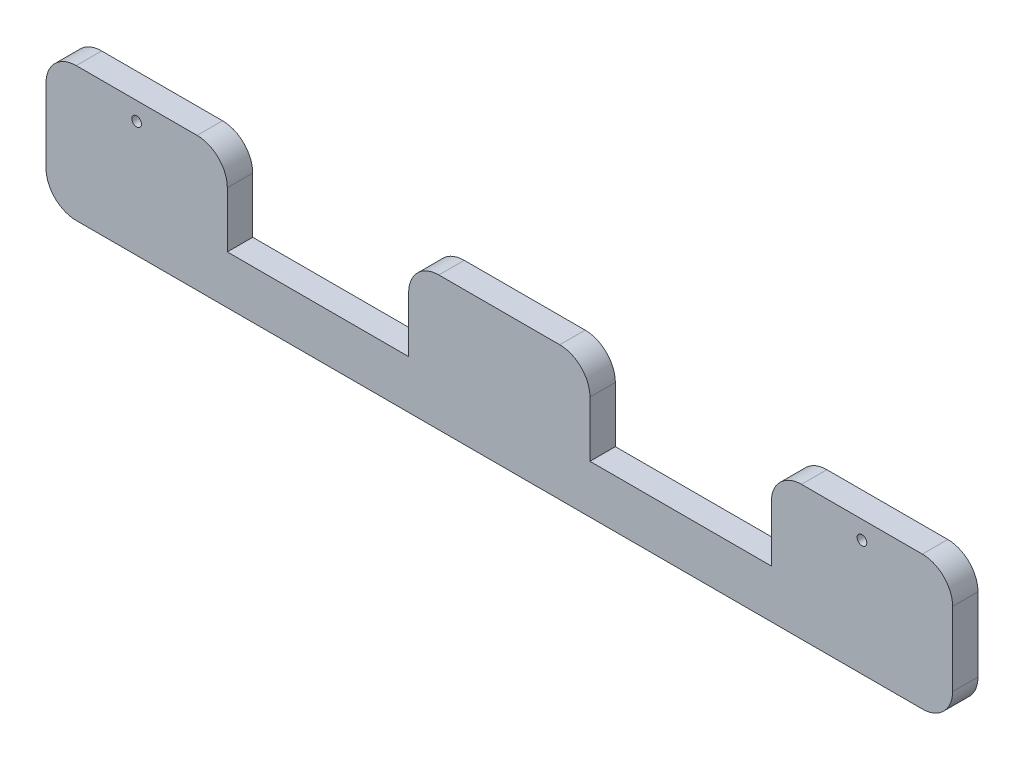
ISO-10303-21;
HEADER;
FILE_DESCRIPTION(('STEP AP214'),'2;1');
FILE_NAME('part.step','',(''),(''),'','','');
FILE_SCHEMA(('AUTOMOTIVE_DESIGN { 1 0 10303 214 1 1 1 1 }'));
ENDSEC;
DATA;
#1=APPLICATION_CONTEXT('core data for automotive mechanical design processes');
#2=APPLICATION_PROTOCOL_DEFINITION('international standard','automotive_design',2000,#1);
#3=PRODUCT_CONTEXT('',#1,'mechanical');
#4=PRODUCT('Part','Part','',(#3));
#5=PRODUCT_RELATED_PRODUCT_CATEGORY('part','',(#4));
#6=PRODUCT_DEFINITION_FORMATION('','',#4);
#7=PRODUCT_DEFINITION_CONTEXT('part definition',#1,'design');
#8=PRODUCT_DEFINITION('design','',#6,#7);
#9=PRODUCT_DEFINITION_SHAPE('','',#8);
#10=(LENGTH_UNIT() NAMED_UNIT(*) SI_UNIT(.MILLI.,.METRE.));
#11=(NAMED_UNIT(*) PLANE_ANGLE_UNIT() SI_UNIT($,.RADIAN.));
#12=(NAMED_UNIT(*) SI_UNIT($,.STERADIAN.) SOLID_ANGLE_UNIT());
#13=UNCERTAINTY_MEASURE_WITH_UNIT(LENGTH_MEASURE(1.E-05),#10,'distance_accuracy_value','');
#14=(GEOMETRIC_REPRESENTATION_CONTEXT(3) GLOBAL_UNCERTAINTY_ASSIGNED_CONTEXT((#13)) GLOBAL_UNIT_ASSIGNED_CONTEXT((#10,
#11,#12)) REPRESENTATION_CONTEXT('',''));
#15=CARTESIAN_POINT('',(0.,0.,0.));
#16=DIRECTION('',(0.,0.,1.));
#17=DIRECTION('',(1.,0.,0.));
#18=AXIS2_PLACEMENT_3D('',#15,#16,#17);
#19=CARTESIAN_POINT('',(-85.0624454176962,-31.2608196621493,5.334));
#20=DIRECTION('',(0.,-1.,0.));
#21=DIRECTION('',(0.,0.,-1.));
#22=AXIS2_PLACEMENT_3D('',#19,#20,#21);
#23=PLANE('',#22);
#24=DIRECTION('',(-1.,0.,0.));
#25=VECTOR('',#24,1.);
#26=CARTESIAN_POINT('',(-85.0624454176962,-31.2608196621493,5.334));
#27=LINE('',#26,#25);
#28=CARTESIAN_POINT('',(22.8875545823038,-31.2608196621493,5.334));
#29=VERTEX_POINT('',#28);
#30=CARTESIAN_POINT('',(-2.5124454176962,-31.2608196621493,5.334));
#31=VERTEX_POINT('',#30);
#32=EDGE_CURVE('E247',#29,#31,#27,.T.);
#33=ORIENTED_EDGE('',*,*,#32,.F.);
#34=DIRECTION('',(0.,0.,1.));
#35=VECTOR('',#34,1.);
#36=CARTESIAN_POINT('',(22.8875545823038,-31.2608196621493,5.334));
#37=LINE('',#36,#35);
#38=CARTESIAN_POINT('',(22.8875545823038,-31.2608196621493,0.));
#39=VERTEX_POINT('',#38);
#40=EDGE_CURVE('E280',#29,#39,#37,.F.);
#41=ORIENTED_EDGE('',*,*,#40,.T.);
#42=DIRECTION('',(-1.,0.,0.));
#43=VECTOR('',#42,1.);
#44=CARTESIAN_POINT('',(-85.0624454176962,-31.2608196621493,0.));
#45=LINE('',#44,#43);
#46=CARTESIAN_POINT('',(-2.5124454176962,-31.2608196621493,0.));
#47=VERTEX_POINT('',#46);
#48=EDGE_CURVE('E259',#39,#47,#45,.T.);
#49=ORIENTED_EDGE('',*,*,#48,.T.);
#50=DIRECTION('',(0.,0.,1.));
#51=VECTOR('',#50,1.);
#52=CARTESIAN_POINT('',(-2.5124454176962,-31.2608196621493,5.334));
#53=LINE('',#52,#51);
#54=EDGE_CURVE('E277',#47,#31,#53,.T.);
#55=ORIENTED_EDGE('',*,*,#54,.T.);
#56=EDGE_LOOP('',(#33,#41,#49,#55));
#57=FACE_BOUND('',#56,.T.);
#58=ADVANCED_FACE('F37',(#57),#23,.F.);
#59=CARTESIAN_POINT('',(-53.3124454176962,-31.2608196621493,5.334));
#60=VERTEX_POINT('',#59);
#61=CARTESIAN_POINT('',(-78.7124454176962,-31.2608196621493,5.334));
#62=VERTEX_POINT('',#61);
#63=EDGE_CURVE('E242',#60,#62,#27,.T.);
#64=ORIENTED_EDGE('',*,*,#63,.F.);
#65=DIRECTION('',(0.,0.,1.));
#66=VECTOR('',#65,1.);
#67=CARTESIAN_POINT('',(-53.3124454176962,-31.2608196621493,5.334));
#68=LINE('',#67,#66);
#69=CARTESIAN_POINT('',(-53.3124454176962,-31.2608196621493,0.));
#70=VERTEX_POINT('',#69);
#71=EDGE_CURVE('E302',#60,#70,#68,.F.);
#72=ORIENTED_EDGE('',*,*,#71,.T.);
#73=CARTESIAN_POINT('',(-78.7124454176962,-31.2608196621493,0.));
#74=VERTEX_POINT('',#73);
#75=EDGE_CURVE('E256',#70,#74,#45,.T.);
#76=ORIENTED_EDGE('',*,*,#75,.T.);
#77=DIRECTION('',(0.,0.,-1.));
#78=VECTOR('',#77,1.);
#79=CARTESIAN_POINT('',(-78.7124454176962,-31.2608196621493,5.334));
#80=LINE('',#79,#78);
#81=EDGE_CURVE('E300',#74,#62,#80,.F.);
#82=ORIENTED_EDGE('',*,*,#81,.T.);
#83=EDGE_LOOP('',(#64,#72,#76,#82));
#84=FACE_BOUND('',#83,.T.);
#85=ADVANCED_FACE('F379',(#84),#23,.F.);
#86=CARTESIAN_POINT('',(-85.0624454176962,-31.2608196621493,5.334));
#87=DIRECTION('',(1.,0.,0.));
#88=DIRECTION('',(0.,1.,0.));
#89=AXIS2_PLACEMENT_3D('',#86,#87,#88);
#90=PLANE('',#89);
#91=DIRECTION('',(0.,-1.,0.));
#92=VECTOR('',#91,1.);
#93=CARTESIAN_POINT('',(-85.0624454176962,-31.2608196621493,0.));
#94=LINE('',#93,#92);
#95=CARTESIAN_POINT('',(-85.0624454176962,-37.6108196621493,0.));
#96=VERTEX_POINT('',#95);
#97=CARTESIAN_POINT('',(-85.0624454176962,-53.1048196621493,0.));
#98=VERTEX_POINT('',#97);
#99=EDGE_CURVE('E229',#96,#98,#94,.T.);
#100=ORIENTED_EDGE('',*,*,#99,.T.);
#101=DIRECTION('',(0.,0.,-1.));
#102=VECTOR('',#101,1.);
#103=CARTESIAN_POINT('',(-85.0624454176962,-53.1048196621493,5.334));
#104=LINE('',#103,#102);
#105=CARTESIAN_POINT('',(-85.0624454176962,-53.1048196621493,5.334));
#106=VERTEX_POINT('',#105);
#107=EDGE_CURVE('E11',#98,#106,#104,.F.);
#108=ORIENTED_EDGE('',*,*,#107,.T.);
#109=DIRECTION('',(0.,-1.,0.));
#110=VECTOR('',#109,1.);
#111=CARTESIAN_POINT('',(-85.0624454176962,-31.2608196621493,5.334));
#112=LINE('',#111,#110);
#113=CARTESIAN_POINT('',(-85.0624454176962,-37.6108196621493,5.334));
#114=VERTEX_POINT('',#113);
#115=EDGE_CURVE('E232',#114,#106,#112,.T.);
#116=ORIENTED_EDGE('',*,*,#115,.F.);
#117=DIRECTION('',(0.,0.,-1.));
#118=VECTOR('',#117,1.);
#119=CARTESIAN_POINT('',(-85.0624454176962,-37.6108196621493,5.334));
#120=LINE('',#119,#118);
#121=EDGE_CURVE('E45',#114,#96,#120,.T.);
#122=ORIENTED_EDGE('',*,*,#121,.T.);
#123=EDGE_LOOP('',(#100,#108,#116,#122));
#124=FACE_BOUND('',#123,.T.);
#125=ADVANCED_FACE('F326',(#124),#90,.F.);
#126=CARTESIAN_POINT('',(-85.0624454176962,-59.4548196621493,5.334));
#127=DIRECTION('',(0.,1.,0.));
#128=DIRECTION('',(0.,0.,1.));
#129=AXIS2_PLACEMENT_3D('',#126,#127,#128);
#130=PLANE('',#129);
#131=DIRECTION('',(1.,0.,0.));
#132=VECTOR('',#131,1.);
#133=CARTESIAN_POINT('',(-85.0624454176962,-59.4548196621493,0.));
#134=LINE('',#133,#132);
#135=CARTESIAN_POINT('',(-78.7124454176962,-59.4548196621493,0.));
#136=VERTEX_POINT('',#135);
#137=CARTESIAN_POINT('',(99.0875545823038,-59.4548196621493,0.));
#138=VERTEX_POINT('',#137);
#139=EDGE_CURVE('E250',#136,#138,#134,.T.);
#140=ORIENTED_EDGE('',*,*,#139,.T.);
#141=DIRECTION('',(0.,0.,-1.));
#142=VECTOR('',#141,1.);
#143=CARTESIAN_POINT('',(99.0875545823038,-59.4548196621493,5.334));
#144=LINE('',#143,#142);
#145=CARTESIAN_POINT('',(99.0875545823038,-59.4548196621493,5.334));
#146=VERTEX_POINT('',#145);
#147=EDGE_CURVE('E320',#138,#146,#144,.F.);
#148=ORIENTED_EDGE('',*,*,#147,.T.);
#149=DIRECTION('',(1.,0.,0.));
#150=VECTOR('',#149,1.);
#151=CARTESIAN_POINT('',(-85.0624454176962,-59.4548196621493,5.334));
#152=LINE('',#151,#150);
#153=CARTESIAN_POINT('',(-78.7124454176962,-59.4548196621493,5.334));
#154=VERTEX_POINT('',#153);
#155=EDGE_CURVE('E235',#154,#146,#152,.T.);
#156=ORIENTED_EDGE('',*,*,#155,.F.);
#157=DIRECTION('',(0.,0.,-1.));
#158=VECTOR('',#157,1.);
#159=CARTESIAN_POINT('',(-78.7124454176962,-59.4548196621493,5.334));
#160=LINE('',#159,#158);
#161=EDGE_CURVE('E317',#154,#136,#160,.T.);
#162=ORIENTED_EDGE('',*,*,#161,.T.);
#163=EDGE_LOOP('',(#140,#148,#156,#162));
#164=FACE_BOUND('',#163,.T.);
#165=ADVANCED_FACE('F337',(#164),#130,.F.);
#166=CARTESIAN_POINT('',(105.437554582304,-31.2608196621493,5.334));
#167=DIRECTION('',(-1.,0.,0.));
#168=DIRECTION('',(0.,-1.,0.));
#169=AXIS2_PLACEMENT_3D('',#166,#167,#168);
#170=PLANE('',#169);
#171=DIRECTION('',(0.,1.,0.));
#172=VECTOR('',#171,1.);
#173=CARTESIAN_POINT('',(105.437554582304,-31.2608196621493,0.));
#174=LINE('',#173,#172);
#175=CARTESIAN_POINT('',(105.437554582304,-53.1048196621493,0.));
#176=VERTEX_POINT('',#175);
#177=CARTESIAN_POINT('',(105.437554582304,-37.6108196621493,0.));
#178=VERTEX_POINT('',#177);
#179=EDGE_CURVE('E253',#176,#178,#174,.T.);
#180=ORIENTED_EDGE('',*,*,#179,.T.);
#181=DIRECTION('',(0.,0.,-1.));
#182=VECTOR('',#181,1.);
#183=CARTESIAN_POINT('',(105.437554582304,-37.6108196621493,5.334));
#184=LINE('',#183,#182);
#185=CARTESIAN_POINT('',(105.437554582304,-37.6108196621493,5.334));
#186=VERTEX_POINT('',#185);
#187=EDGE_CURVE('E315',#178,#186,#184,.F.);
#188=ORIENTED_EDGE('',*,*,#187,.T.);
#189=DIRECTION('',(0.,1.,0.));
#190=VECTOR('',#189,1.);
#191=CARTESIAN_POINT('',(105.437554582304,-31.2608196621493,5.334));
#192=LINE('',#191,#190);
#193=CARTESIAN_POINT('',(105.437554582304,-53.1048196621493,5.334));
#194=VERTEX_POINT('',#193);
#195=EDGE_CURVE('E239',#194,#186,#192,.T.);
#196=ORIENTED_EDGE('',*,*,#195,.F.);
#197=DIRECTION('',(0.,0.,-1.));
#198=VECTOR('',#197,1.);
#199=CARTESIAN_POINT('',(105.437554582304,-53.1048196621493,5.334));
#200=LINE('',#199,#198);
#201=EDGE_CURVE('E312',#194,#176,#200,.T.);
#202=ORIENTED_EDGE('',*,*,#201,.T.);
#203=EDGE_LOOP('',(#180,#188,#196,#202));
#204=FACE_BOUND('',#203,.T.);
#205=ADVANCED_FACE('F348',(#204),#170,.F.);
#206=CARTESIAN_POINT('',(99.0875545823038,-31.2608196621493,0.));
#207=VERTEX_POINT('',#206);
#208=CARTESIAN_POINT('',(73.6875545823038,-31.2608196621493,0.));
#209=VERTEX_POINT('',#208);
#210=EDGE_CURVE('E236',#207,#209,#45,.T.);
#211=ORIENTED_EDGE('',*,*,#210,.T.);
#212=DIRECTION('',(0.,0.,1.));
#213=VECTOR('',#212,1.);
#214=CARTESIAN_POINT('',(73.6875545823038,-31.2608196621493,5.334));
#215=LINE('',#214,#213);
#216=CARTESIAN_POINT('',(73.6875545823038,-31.2608196621493,5.334));
#217=VERTEX_POINT('',#216);
#218=EDGE_CURVE('E307',#209,#217,#215,.T.);
#219=ORIENTED_EDGE('',*,*,#218,.T.);
#220=CARTESIAN_POINT('',(99.0875545823038,-31.2608196621493,5.334));
#221=VERTEX_POINT('',#220);
#222=EDGE_CURVE('E243',#221,#217,#27,.T.);
#223=ORIENTED_EDGE('',*,*,#222,.F.);
#224=DIRECTION('',(0.,0.,-1.));
#225=VECTOR('',#224,1.);
#226=CARTESIAN_POINT('',(99.0875545823038,-31.2608196621493,5.334));
#227=LINE('',#226,#225);
#228=EDGE_CURVE('E304',#221,#207,#227,.T.);
#229=ORIENTED_EDGE('',*,*,#228,.T.);
#230=EDGE_LOOP('',(#211,#219,#223,#229));
#231=FACE_BOUND('',#230,.T.);
#232=ADVANCED_FACE('F358',(#231),#23,.F.);
#233=CARTESIAN_POINT('',(0.,0.,5.334));
#234=DIRECTION('',(0.,0.,1.));
#235=DIRECTION('',(1.,0.,0.));
#236=AXIS2_PLACEMENT_3D('',#233,#234,#235);
#237=PLANE('',#236);
#238=CARTESIAN_POINT('',(86.3875545823038,-35.0708196621493,5.334));
#239=DIRECTION('',(0.,0.,1.));
#240=DIRECTION('',(-1.,0.,0.));
#241=AXIS2_PLACEMENT_3D('',#238,#239,#240);
#242=CIRCLE('',#241,1.016);
#243=CARTESIAN_POINT('',(85.3715545823038,-35.0708196621493,5.334));
#244=VERTEX_POINT('',#243);
#245=EDGE_CURVE('E458',#244,#244,#242,.T.);
#246=ORIENTED_EDGE('',*,*,#245,.F.);
#247=EDGE_LOOP('',(#246));
#248=FACE_BOUND('',#247,.T.);
#249=CARTESIAN_POINT('',(-66.0124454176962,-35.0708196621493,5.334));
#250=DIRECTION('',(0.,0.,1.));
#251=DIRECTION('',(1.,0.,0.));
#252=AXIS2_PLACEMENT_3D('',#249,#250,#251);
#253=CIRCLE('',#252,1.016);
#254=CARTESIAN_POINT('',(-64.9964454176962,-35.0708196621493,5.334));
#255=VERTEX_POINT('',#254);
#256=EDGE_CURVE('E454',#255,#255,#253,.T.);
#257=ORIENTED_EDGE('',*,*,#256,.F.);
#258=EDGE_LOOP('',(#257));
#259=FACE_BOUND('',#258,.T.);
#260=DIRECTION('',(0.,-1.,0.));
#261=VECTOR('',#260,1.);
#262=CARTESIAN_POINT('',(29.2375545823038,-31.2608196621493,5.334));
#263=LINE('',#262,#261);
#264=CARTESIAN_POINT('',(29.2375545823038,-37.6108196621493,5.334));
#265=VERTEX_POINT('',#264);
#266=CARTESIAN_POINT('',(29.2375545823038,-49.2948196621493,5.334));
#267=VERTEX_POINT('',#266);
#268=EDGE_CURVE('E192',#265,#267,#263,.T.);
#269=ORIENTED_EDGE('',*,*,#268,.F.);
#270=CARTESIAN_POINT('',(22.8875545823038,-37.6108196621493,5.334));
#271=DIRECTION('',(0.,0.,1.));
#272=DIRECTION('',(1.,0.,0.));
#273=AXIS2_PLACEMENT_3D('',#270,#271,#272);
#274=CIRCLE('',#273,6.35);
#275=EDGE_CURVE('E275',#265,#29,#274,.T.);
#276=ORIENTED_EDGE('',*,*,#275,.T.);
#277=ORIENTED_EDGE('',*,*,#32,.T.);
#278=CARTESIAN_POINT('',(-2.5124454176962,-37.6108196621493,5.334));
#279=DIRECTION('',(0.,0.,1.));
#280=DIRECTION('',(1.,0.,0.));
#281=AXIS2_PLACEMENT_3D('',#278,#279,#280);
#282=CIRCLE('',#281,6.35);
#283=CARTESIAN_POINT('',(-8.86244541769619,-37.6108196621493,5.334));
#284=VERTEX_POINT('',#283);
#285=EDGE_CURVE('E273',#31,#284,#282,.T.);
#286=ORIENTED_EDGE('',*,*,#285,.T.);
#287=DIRECTION('',(0.,1.,0.));
#288=VECTOR('',#287,1.);
#289=CARTESIAN_POINT('',(-8.86244541769619,-31.2608196621493,5.334));
#290=LINE('',#289,#288);
#291=CARTESIAN_POINT('',(-8.86244541769619,-49.2948196621493,5.334));
#292=VERTEX_POINT('',#291);
#293=EDGE_CURVE('E216',#292,#284,#290,.T.);
#294=ORIENTED_EDGE('',*,*,#293,.F.);
#295=DIRECTION('',(1.,0.,0.));
#296=VECTOR('',#295,1.);
#297=CARTESIAN_POINT('',(-46.9624454176962,-49.2948196621493,5.334));
#298=LINE('',#297,#296);
#299=CARTESIAN_POINT('',(-46.9624454176962,-49.2948196621493,5.334));
#300=VERTEX_POINT('',#299);
#301=EDGE_CURVE('E223',#300,#292,#298,.T.);
#302=ORIENTED_EDGE('',*,*,#301,.F.);
#303=DIRECTION('',(0.,-1.,0.));
#304=VECTOR('',#303,1.);
#305=CARTESIAN_POINT('',(-46.9624454176962,-31.2608196621493,5.334));
#306=LINE('',#305,#304);
#307=CARTESIAN_POINT('',(-46.9624454176962,-37.6108196621493,5.334));
#308=VERTEX_POINT('',#307);
#309=EDGE_CURVE('E211',#308,#300,#306,.T.);
#310=ORIENTED_EDGE('',*,*,#309,.F.);
#311=CARTESIAN_POINT('',(-53.3124454176962,-37.6108196621493,5.334));
#312=DIRECTION('',(0.,0.,1.));
#313=DIRECTION('',(1.,0.,0.));
#314=AXIS2_PLACEMENT_3D('',#311,#312,#313);
#315=CIRCLE('',#314,6.35);
#316=EDGE_CURVE('E271',#308,#60,#315,.T.);
#317=ORIENTED_EDGE('',*,*,#316,.T.);
#318=ORIENTED_EDGE('',*,*,#63,.T.);
#319=CARTESIAN_POINT('',(-78.7124454176962,-37.6108196621493,5.334));
#320=DIRECTION('',(0.,0.,1.));
#321=DIRECTION('',(1.,0.,0.));
#322=AXIS2_PLACEMENT_3D('',#319,#320,#321);
#323=CIRCLE('',#322,6.35);
#324=EDGE_CURVE('E261',#62,#114,#323,.T.);
#325=ORIENTED_EDGE('',*,*,#324,.T.);
#326=ORIENTED_EDGE('',*,*,#115,.T.);
#327=CARTESIAN_POINT('',(-78.7124454176962,-53.1048196621493,5.334));
#328=DIRECTION('',(0.,0.,1.));
#329=DIRECTION('',(1.,0.,0.));
#330=AXIS2_PLACEMENT_3D('',#327,#328,#329);
#331=CIRCLE('',#330,6.35);
#332=EDGE_CURVE('E263',#106,#154,#331,.T.);
#333=ORIENTED_EDGE('',*,*,#332,.T.);
#334=ORIENTED_EDGE('',*,*,#155,.T.);
#335=CARTESIAN_POINT('',(99.0875545823038,-53.1048196621493,5.334));
#336=DIRECTION('',(0.,0.,1.));
#337=DIRECTION('',(1.,0.,0.));
#338=AXIS2_PLACEMENT_3D('',#335,#336,#337);
#339=CIRCLE('',#338,6.35);
#340=EDGE_CURVE('E265',#146,#194,#339,.T.);
#341=ORIENTED_EDGE('',*,*,#340,.T.);
#342=ORIENTED_EDGE('',*,*,#195,.T.);
#343=CARTESIAN_POINT('',(99.0875545823038,-37.6108196621493,5.334));
#344=DIRECTION('',(0.,0.,1.));
#345=DIRECTION('',(1.,0.,0.));
#346=AXIS2_PLACEMENT_3D('',#343,#344,#345);
#347=CIRCLE('',#346,6.35);
#348=EDGE_CURVE('E267',#186,#221,#347,.T.);
#349=ORIENTED_EDGE('',*,*,#348,.T.);
#350=ORIENTED_EDGE('',*,*,#222,.T.);
#351=CARTESIAN_POINT('',(73.6875545823038,-37.6108196621493,5.334));
#352=DIRECTION('',(0.,0.,1.));
#353=DIRECTION('',(1.,0.,0.));
#354=AXIS2_PLACEMENT_3D('',#351,#352,#353);
#355=CIRCLE('',#354,6.35);
#356=CARTESIAN_POINT('',(67.3375545823038,-37.6108196621493,5.334));
#357=VERTEX_POINT('',#356);
#358=EDGE_CURVE('E269',#217,#357,#355,.T.);
#359=ORIENTED_EDGE('',*,*,#358,.T.);
#360=DIRECTION('',(0.,1.,0.));
#361=VECTOR('',#360,1.);
#362=CARTESIAN_POINT('',(67.3375545823038,-31.2608196621493,5.334));
#363=LINE('',#362,#361);
#364=CARTESIAN_POINT('',(67.3375545823038,-49.2948196621493,5.334));
#365=VERTEX_POINT('',#364);
#366=EDGE_CURVE('E186',#365,#357,#363,.T.);
#367=ORIENTED_EDGE('',*,*,#366,.F.);
#368=DIRECTION('',(1.,0.,0.));
#369=VECTOR('',#368,1.);
#370=CARTESIAN_POINT('',(29.2375545823038,-49.2948196621493,5.334));
#371=LINE('',#370,#369);
#372=EDGE_CURVE('E206',#267,#365,#371,.T.);
#373=ORIENTED_EDGE('',*,*,#372,.F.);
#374=EDGE_LOOP('',(#269,#276,#277,#286,#294,#302,#310,#317,#318,#325,#326,#333,#334,#341,#342,
#349,#350,#359,#367,#373));
#375=FACE_BOUND('',#374,.T.);
#376=ADVANCED_FACE('F341',(#248,#259,#375),#237,.T.);
#377=CARTESIAN_POINT('',(0.,0.,0.));
#378=DIRECTION('',(0.,0.,1.));
#379=DIRECTION('',(1.,0.,0.));
#380=AXIS2_PLACEMENT_3D('',#377,#378,#379);
#381=PLANE('',#380);
#382=CARTESIAN_POINT('',(86.3875545823038,-35.0708196621493,0.));
#383=DIRECTION('',(0.,0.,1.));
#384=DIRECTION('',(-1.,0.,0.));
#385=AXIS2_PLACEMENT_3D('',#382,#383,#384);
#386=CIRCLE('',#385,1.016);
#387=CARTESIAN_POINT('',(85.3715545823038,-35.0708196621493,0.));
#388=VERTEX_POINT('',#387);
#389=EDGE_CURVE('E450',#388,#388,#386,.T.);
#390=ORIENTED_EDGE('',*,*,#389,.T.);
#391=EDGE_LOOP('',(#390));
#392=FACE_BOUND('',#391,.T.);
#393=CARTESIAN_POINT('',(-66.0124454176962,-35.0708196621493,0.));
#394=DIRECTION('',(0.,0.,1.));
#395=DIRECTION('',(1.,0.,0.));
#396=AXIS2_PLACEMENT_3D('',#393,#394,#395);
#397=CIRCLE('',#396,1.016);
#398=CARTESIAN_POINT('',(-64.9964454176962,-35.0708196621493,0.));
#399=VERTEX_POINT('',#398);
#400=EDGE_CURVE('E207',#399,#399,#397,.T.);
#401=ORIENTED_EDGE('',*,*,#400,.T.);
#402=EDGE_LOOP('',(#401));
#403=FACE_BOUND('',#402,.T.);
#404=ORIENTED_EDGE('',*,*,#48,.F.);
#405=CARTESIAN_POINT('',(22.8875545823038,-37.6108196621493,0.));
#406=DIRECTION('',(0.,0.,1.));
#407=DIRECTION('',(1.,0.,0.));
#408=AXIS2_PLACEMENT_3D('',#405,#406,#407);
#409=CIRCLE('',#408,6.35);
#410=CARTESIAN_POINT('',(29.2375545823038,-37.6108196621493,0.));
#411=VERTEX_POINT('',#410);
#412=EDGE_CURVE('E182',#39,#411,#409,.F.);
#413=ORIENTED_EDGE('',*,*,#412,.T.);
#414=DIRECTION('',(0.,-1.,0.));
#415=VECTOR('',#414,1.);
#416=CARTESIAN_POINT('',(29.2375545823038,-31.2608196621493,0.));
#417=LINE('',#416,#415);
#418=CARTESIAN_POINT('',(29.2375545823038,-49.2948196621493,0.));
#419=VERTEX_POINT('',#418);
#420=EDGE_CURVE('E174',#411,#419,#417,.T.);
#421=ORIENTED_EDGE('',*,*,#420,.T.);
#422=DIRECTION('',(1.,0.,0.));
#423=VECTOR('',#422,1.);
#424=CARTESIAN_POINT('',(29.2375545823038,-49.2948196621493,0.));
#425=LINE('',#424,#423);
#426=CARTESIAN_POINT('',(67.3375545823038,-49.2948196621493,0.));
#427=VERTEX_POINT('',#426);
#428=EDGE_CURVE('E180',#419,#427,#425,.T.);
#429=ORIENTED_EDGE('',*,*,#428,.T.);
#430=DIRECTION('',(0.,1.,0.));
#431=VECTOR('',#430,1.);
#432=CARTESIAN_POINT('',(67.3375545823038,-31.2608196621493,0.));
#433=LINE('',#432,#431);
#434=CARTESIAN_POINT('',(67.3375545823038,-37.6108196621493,0.));
#435=VERTEX_POINT('',#434);
#436=EDGE_CURVE('E197',#427,#435,#433,.T.);
#437=ORIENTED_EDGE('',*,*,#436,.T.);
#438=CARTESIAN_POINT('',(73.6875545823038,-37.6108196621493,0.));
#439=DIRECTION('',(0.,0.,1.));
#440=DIRECTION('',(1.,0.,0.));
#441=AXIS2_PLACEMENT_3D('',#438,#439,#440);
#442=CIRCLE('',#441,6.35);
#443=EDGE_CURVE('E290',#435,#209,#442,.F.);
#444=ORIENTED_EDGE('',*,*,#443,.T.);
#445=ORIENTED_EDGE('',*,*,#210,.F.);
#446=CARTESIAN_POINT('',(99.0875545823038,-37.6108196621493,0.));
#447=DIRECTION('',(0.,0.,1.));
#448=DIRECTION('',(1.,0.,0.));
#449=AXIS2_PLACEMENT_3D('',#446,#447,#448);
#450=CIRCLE('',#449,6.35);
#451=EDGE_CURVE('E288',#207,#178,#450,.F.);
#452=ORIENTED_EDGE('',*,*,#451,.T.);
#453=ORIENTED_EDGE('',*,*,#179,.F.);
#454=CARTESIAN_POINT('',(99.0875545823038,-53.1048196621493,0.));
#455=DIRECTION('',(0.,0.,1.));
#456=DIRECTION('',(1.,0.,0.));
#457=AXIS2_PLACEMENT_3D('',#454,#455,#456);
#458=CIRCLE('',#457,6.35);
#459=EDGE_CURVE('E286',#176,#138,#458,.F.);
#460=ORIENTED_EDGE('',*,*,#459,.T.);
#461=ORIENTED_EDGE('',*,*,#139,.F.);
#462=CARTESIAN_POINT('',(-78.7124454176962,-53.1048196621493,0.));
#463=DIRECTION('',(0.,0.,1.));
#464=DIRECTION('',(1.,0.,0.));
#465=AXIS2_PLACEMENT_3D('',#462,#463,#464);
#466=CIRCLE('',#465,6.35);
#467=EDGE_CURVE('E284',#136,#98,#466,.F.);
#468=ORIENTED_EDGE('',*,*,#467,.T.);
#469=ORIENTED_EDGE('',*,*,#99,.F.);
#470=CARTESIAN_POINT('',(-78.7124454176962,-37.6108196621493,0.));
#471=DIRECTION('',(0.,0.,1.));
#472=DIRECTION('',(1.,0.,0.));
#473=AXIS2_PLACEMENT_3D('',#470,#471,#472);
#474=CIRCLE('',#473,6.35);
#475=EDGE_CURVE('E282',#96,#74,#474,.F.);
#476=ORIENTED_EDGE('',*,*,#475,.T.);
#477=ORIENTED_EDGE('',*,*,#75,.F.);
#478=CARTESIAN_POINT('',(-53.3124454176962,-37.6108196621493,0.));
#479=DIRECTION('',(0.,0.,1.));
#480=DIRECTION('',(1.,0.,0.));
#481=AXIS2_PLACEMENT_3D('',#478,#479,#480);
#482=CIRCLE('',#481,6.35);
#483=CARTESIAN_POINT('',(-46.9624454176962,-37.6108196621493,0.));
#484=VERTEX_POINT('',#483);
#485=EDGE_CURVE('E60',#70,#484,#482,.F.);
#486=ORIENTED_EDGE('',*,*,#485,.T.);
#487=DIRECTION('',(0.,-1.,0.));
#488=VECTOR('',#487,1.);
#489=CARTESIAN_POINT('',(-46.9624454176962,-31.2608196621493,0.));
#490=LINE('',#489,#488);
#491=CARTESIAN_POINT('',(-46.9624454176962,-49.2948196621493,0.));
#492=VERTEX_POINT('',#491);
#493=EDGE_CURVE('E213',#484,#492,#490,.T.);
#494=ORIENTED_EDGE('',*,*,#493,.T.);
#495=DIRECTION('',(1.,0.,0.));
#496=VECTOR('',#495,1.);
#497=CARTESIAN_POINT('',(-46.9624454176962,-49.2948196621493,0.));
#498=LINE('',#497,#496);
#499=CARTESIAN_POINT('',(-8.86244541769619,-49.2948196621493,0.));
#500=VERTEX_POINT('',#499);
#501=EDGE_CURVE('E215',#492,#500,#498,.T.);
#502=ORIENTED_EDGE('',*,*,#501,.T.);
#503=DIRECTION('',(0.,1.,0.));
#504=VECTOR('',#503,1.);
#505=CARTESIAN_POINT('',(-8.86244541769619,-31.2608196621493,0.));
#506=LINE('',#505,#504);
#507=CARTESIAN_POINT('',(-8.86244541769619,-37.6108196621493,0.));
#508=VERTEX_POINT('',#507);
#509=EDGE_CURVE('E219',#500,#508,#506,.T.);
#510=ORIENTED_EDGE('',*,*,#509,.T.);
#511=CARTESIAN_POINT('',(-2.5124454176962,-37.6108196621493,0.));
#512=DIRECTION('',(0.,0.,1.));
#513=DIRECTION('',(1.,0.,0.));
#514=AXIS2_PLACEMENT_3D('',#511,#512,#513);
#515=CIRCLE('',#514,6.35);
#516=EDGE_CURVE('E293',#508,#47,#515,.F.);
#517=ORIENTED_EDGE('',*,*,#516,.T.);
#518=EDGE_LOOP('',(#404,#413,#421,#429,#437,#444,#445,#452,#453,#460,#461,#468,#469,#476,#477,
#486,#494,#502,#510,#517));
#519=FACE_BOUND('',#518,.T.);
#520=ADVANCED_FACE('F177',(#392,#403,#519),#381,.F.);
#521=CARTESIAN_POINT('',(-46.9624454176962,-31.2608196621493,0.));
#522=DIRECTION('',(-1.,0.,0.));
#523=DIRECTION('',(0.,0.,1.));
#524=AXIS2_PLACEMENT_3D('',#521,#522,#523);
#525=PLANE('',#524);
#526=ORIENTED_EDGE('',*,*,#493,.F.);
#527=DIRECTION('',(0.,0.,1.));
#528=VECTOR('',#527,1.);
#529=CARTESIAN_POINT('',(-46.9624454176962,-37.6108196621493,0.));
#530=LINE('',#529,#528);
#531=EDGE_CURVE('E297',#484,#308,#530,.T.);
#532=ORIENTED_EDGE('',*,*,#531,.T.);
#533=ORIENTED_EDGE('',*,*,#309,.T.);
#534=DIRECTION('',(0.,0.,1.));
#535=VECTOR('',#534,1.);
#536=CARTESIAN_POINT('',(-46.9624454176962,-49.2948196621493,0.));
#537=LINE('',#536,#535);
#538=EDGE_CURVE('E221',#492,#300,#537,.T.);
#539=ORIENTED_EDGE('',*,*,#538,.F.);
#540=EDGE_LOOP('',(#526,#532,#533,#539));
#541=FACE_BOUND('',#540,.T.);
#542=ADVANCED_FACE('F425',(#541),#525,.F.);
#543=CARTESIAN_POINT('',(-8.86244541769619,-31.2608196621493,0.));
#544=DIRECTION('',(1.,0.,0.));
#545=DIRECTION('',(0.,1.,0.));
#546=AXIS2_PLACEMENT_3D('',#543,#544,#545);
#547=PLANE('',#546);
#548=ORIENTED_EDGE('',*,*,#293,.T.);
#549=DIRECTION('',(0.,0.,1.));
#550=VECTOR('',#549,1.);
#551=CARTESIAN_POINT('',(-8.86244541769619,-37.6108196621493,0.));
#552=LINE('',#551,#550);
#553=EDGE_CURVE('E52',#284,#508,#552,.F.);
#554=ORIENTED_EDGE('',*,*,#553,.T.);
#555=ORIENTED_EDGE('',*,*,#509,.F.);
#556=DIRECTION('',(0.,0.,1.));
#557=VECTOR('',#556,1.);
#558=CARTESIAN_POINT('',(-8.86244541769619,-49.2948196621493,0.));
#559=LINE('',#558,#557);
#560=EDGE_CURVE('E227',#500,#292,#559,.T.);
#561=ORIENTED_EDGE('',*,*,#560,.T.);
#562=EDGE_LOOP('',(#548,#554,#555,#561));
#563=FACE_BOUND('',#562,.T.);
#564=ADVANCED_FACE('F432',(#563),#547,.F.);
#565=CARTESIAN_POINT('',(-46.9624454176962,-49.2948196621493,0.));
#566=DIRECTION('',(0.,-1.,0.));
#567=DIRECTION('',(0.,0.,-1.));
#568=AXIS2_PLACEMENT_3D('',#565,#566,#567);
#569=PLANE('',#568);
#570=ORIENTED_EDGE('',*,*,#301,.T.);
#571=ORIENTED_EDGE('',*,*,#560,.F.);
#572=ORIENTED_EDGE('',*,*,#501,.F.);
#573=ORIENTED_EDGE('',*,*,#538,.T.);
#574=EDGE_LOOP('',(#570,#571,#572,#573));
#575=FACE_BOUND('',#574,.T.);
#576=ADVANCED_FACE('F430',(#575),#569,.F.);
#577=CARTESIAN_POINT('',(29.2375545823038,-31.2608196621493,0.));
#578=DIRECTION('',(-1.,0.,0.));
#579=DIRECTION('',(0.,0.,1.));
#580=AXIS2_PLACEMENT_3D('',#577,#578,#579);
#581=PLANE('',#580);
#582=ORIENTED_EDGE('',*,*,#420,.F.);
#583=DIRECTION('',(0.,0.,1.));
#584=VECTOR('',#583,1.);
#585=CARTESIAN_POINT('',(29.2375545823038,-37.6108196621493,0.));
#586=LINE('',#585,#584);
#587=EDGE_CURVE('E246',#411,#265,#586,.T.);
#588=ORIENTED_EDGE('',*,*,#587,.T.);
#589=ORIENTED_EDGE('',*,*,#268,.T.);
#590=DIRECTION('',(0.,0.,1.));
#591=VECTOR('',#590,1.);
#592=CARTESIAN_POINT('',(29.2375545823038,-49.2948196621493,0.));
#593=LINE('',#592,#591);
#594=EDGE_CURVE('E189',#419,#267,#593,.T.);
#595=ORIENTED_EDGE('',*,*,#594,.F.);
#596=EDGE_LOOP('',(#582,#588,#589,#595));
#597=FACE_BOUND('',#596,.T.);
#598=ADVANCED_FACE('F190',(#597),#581,.F.);
#599=CARTESIAN_POINT('',(67.3375545823038,-31.2608196621493,0.));
#600=DIRECTION('',(1.,0.,0.));
#601=DIRECTION('',(0.,0.,-1.));
#602=AXIS2_PLACEMENT_3D('',#599,#600,#601);
#603=PLANE('',#602);
#604=ORIENTED_EDGE('',*,*,#366,.T.);
#605=DIRECTION('',(0.,0.,1.));
#606=VECTOR('',#605,1.);
#607=CARTESIAN_POINT('',(67.3375545823038,-37.6108196621493,0.));
#608=LINE('',#607,#606);
#609=EDGE_CURVE('E310',#357,#435,#608,.F.);
#610=ORIENTED_EDGE('',*,*,#609,.T.);
#611=ORIENTED_EDGE('',*,*,#436,.F.);
#612=DIRECTION('',(0.,0.,1.));
#613=VECTOR('',#612,1.);
#614=CARTESIAN_POINT('',(67.3375545823038,-49.2948196621493,0.));
#615=LINE('',#614,#613);
#616=EDGE_CURVE('E196',#427,#365,#615,.T.);
#617=ORIENTED_EDGE('',*,*,#616,.T.);
#618=EDGE_LOOP('',(#604,#610,#611,#617));
#619=FACE_BOUND('',#618,.T.);
#620=ADVANCED_FACE('F364',(#619),#603,.F.);
#621=CARTESIAN_POINT('',(29.2375545823038,-49.2948196621493,0.));
#622=DIRECTION('',(0.,-1.,0.));
#623=DIRECTION('',(0.,0.,-1.));
#624=AXIS2_PLACEMENT_3D('',#621,#622,#623);
#625=PLANE('',#624);
#626=ORIENTED_EDGE('',*,*,#372,.T.);
#627=ORIENTED_EDGE('',*,*,#616,.F.);
#628=ORIENTED_EDGE('',*,*,#428,.F.);
#629=ORIENTED_EDGE('',*,*,#594,.T.);
#630=EDGE_LOOP('',(#626,#627,#628,#629));
#631=FACE_BOUND('',#630,.T.);
#632=ADVANCED_FACE('F200',(#631),#625,.F.);
#633=CARTESIAN_POINT('',(-66.0124454176962,-35.0708196621493,0.));
#634=DIRECTION('',(0.,0.,1.));
#635=DIRECTION('',(1.,0.,0.));
#636=AXIS2_PLACEMENT_3D('',#633,#634,#635);
#637=CYLINDRICAL_SURFACE('',#636,1.016);
#638=ORIENTED_EDGE('',*,*,#400,.F.);
#639=EDGE_LOOP('',(#638));
#640=FACE_BOUND('',#639,.T.);
#641=ORIENTED_EDGE('',*,*,#256,.T.);
#642=EDGE_LOOP('',(#641));
#643=FACE_BOUND('',#642,.T.);
#644=ADVANCED_FACE('F466',(#640,#643),#637,.F.);
#645=CARTESIAN_POINT('',(86.3875545823038,-35.0708196621493,0.));
#646=DIRECTION('',(0.,0.,1.));
#647=DIRECTION('',(1.,0.,0.));
#648=AXIS2_PLACEMENT_3D('',#645,#646,#647);
#649=CYLINDRICAL_SURFACE('',#648,1.016);
#650=ORIENTED_EDGE('',*,*,#389,.F.);
#651=EDGE_LOOP('',(#650));
#652=FACE_BOUND('',#651,.T.);
#653=ORIENTED_EDGE('',*,*,#245,.T.);
#654=EDGE_LOOP('',(#653));
#655=FACE_BOUND('',#654,.T.);
#656=ADVANCED_FACE('F406',(#652,#655),#649,.F.);
#657=CARTESIAN_POINT('',(22.8875545823038,-37.6108196621493,0.));
#658=DIRECTION('',(0.,0.,1.));
#659=DIRECTION('',(1.,0.,0.));
#660=AXIS2_PLACEMENT_3D('',#657,#658,#659);
#661=CYLINDRICAL_SURFACE('',#660,6.35);
#662=ORIENTED_EDGE('',*,*,#412,.F.);
#663=ORIENTED_EDGE('',*,*,#40,.F.);
#664=ORIENTED_EDGE('',*,*,#275,.F.);
#665=ORIENTED_EDGE('',*,*,#587,.F.);
#666=EDGE_LOOP('',(#662,#663,#664,#665));
#667=FACE_BOUND('',#666,.T.);
#668=ADVANCED_FACE('F403',(#667),#661,.T.);
#669=CARTESIAN_POINT('',(-2.5124454176962,-37.6108196621493,5.334));
#670=DIRECTION('',(0.,0.,1.));
#671=DIRECTION('',(1.,0.,0.));
#672=AXIS2_PLACEMENT_3D('',#669,#670,#671);
#673=CYLINDRICAL_SURFACE('',#672,6.35);
#674=ORIENTED_EDGE('',*,*,#516,.F.);
#675=ORIENTED_EDGE('',*,*,#553,.F.);
#676=ORIENTED_EDGE('',*,*,#285,.F.);
#677=ORIENTED_EDGE('',*,*,#54,.F.);
#678=EDGE_LOOP('',(#674,#675,#676,#677));
#679=FACE_BOUND('',#678,.T.);
#680=ADVANCED_FACE('F375',(#679),#673,.T.);
#681=CARTESIAN_POINT('',(-53.3124454176962,-37.6108196621493,0.));
#682=DIRECTION('',(0.,0.,1.));
#683=DIRECTION('',(1.,0.,0.));
#684=AXIS2_PLACEMENT_3D('',#681,#682,#683);
#685=CYLINDRICAL_SURFACE('',#684,6.35);
#686=ORIENTED_EDGE('',*,*,#485,.F.);
#687=ORIENTED_EDGE('',*,*,#71,.F.);
#688=ORIENTED_EDGE('',*,*,#316,.F.);
#689=ORIENTED_EDGE('',*,*,#531,.F.);
#690=EDGE_LOOP('',(#686,#687,#688,#689));
#691=FACE_BOUND('',#690,.T.);
#692=ADVANCED_FACE('F368',(#691),#685,.T.);
#693=CARTESIAN_POINT('',(73.6875545823038,-37.6108196621493,5.334));
#694=DIRECTION('',(0.,0.,1.));
#695=DIRECTION('',(1.,0.,0.));
#696=AXIS2_PLACEMENT_3D('',#693,#694,#695);
#697=CYLINDRICAL_SURFACE('',#696,6.35);
#698=ORIENTED_EDGE('',*,*,#443,.F.);
#699=ORIENTED_EDGE('',*,*,#609,.F.);
#700=ORIENTED_EDGE('',*,*,#358,.F.);
#701=ORIENTED_EDGE('',*,*,#218,.F.);
#702=EDGE_LOOP('',(#698,#699,#700,#701));
#703=FACE_BOUND('',#702,.T.);
#704=ADVANCED_FACE('F366',(#703),#697,.T.);
#705=CARTESIAN_POINT('',(99.0875545823038,-37.6108196621493,5.334));
#706=DIRECTION('',(0.,0.,-1.));
#707=DIRECTION('',(-1.,0.,0.));
#708=AXIS2_PLACEMENT_3D('',#705,#706,#707);
#709=CYLINDRICAL_SURFACE('',#708,6.35);
#710=ORIENTED_EDGE('',*,*,#348,.F.);
#711=ORIENTED_EDGE('',*,*,#187,.F.);
#712=ORIENTED_EDGE('',*,*,#451,.F.);
#713=ORIENTED_EDGE('',*,*,#228,.F.);
#714=EDGE_LOOP('',(#710,#711,#712,#713));
#715=FACE_BOUND('',#714,.T.);
#716=ADVANCED_FACE('F355',(#715),#709,.T.);
#717=CARTESIAN_POINT('',(99.0875545823038,-53.1048196621493,5.334));
#718=DIRECTION('',(0.,0.,-1.));
#719=DIRECTION('',(-1.,0.,0.));
#720=AXIS2_PLACEMENT_3D('',#717,#718,#719);
#721=CYLINDRICAL_SURFACE('',#720,6.35);
#722=ORIENTED_EDGE('',*,*,#340,.F.);
#723=ORIENTED_EDGE('',*,*,#147,.F.);
#724=ORIENTED_EDGE('',*,*,#459,.F.);
#725=ORIENTED_EDGE('',*,*,#201,.F.);
#726=EDGE_LOOP('',(#722,#723,#724,#725));
#727=FACE_BOUND('',#726,.T.);
#728=ADVANCED_FACE('F345',(#727),#721,.T.);
#729=CARTESIAN_POINT('',(-78.7124454176962,-53.1048196621493,5.334));
#730=DIRECTION('',(0.,0.,-1.));
#731=DIRECTION('',(-1.,0.,0.));
#732=AXIS2_PLACEMENT_3D('',#729,#730,#731);
#733=CYLINDRICAL_SURFACE('',#732,6.35);
#734=ORIENTED_EDGE('',*,*,#332,.F.);
#735=ORIENTED_EDGE('',*,*,#107,.F.);
#736=ORIENTED_EDGE('',*,*,#467,.F.);
#737=ORIENTED_EDGE('',*,*,#161,.F.);
#738=EDGE_LOOP('',(#734,#735,#736,#737));
#739=FACE_BOUND('',#738,.T.);
#740=ADVANCED_FACE('F334',(#739),#733,.T.);
#741=CARTESIAN_POINT('',(-78.7124454176962,-37.6108196621493,5.334));
#742=DIRECTION('',(0.,0.,-1.));
#743=DIRECTION('',(-1.,0.,0.));
#744=AXIS2_PLACEMENT_3D('',#741,#742,#743);
#745=CYLINDRICAL_SURFACE('',#744,6.35);
#746=ORIENTED_EDGE('',*,*,#324,.F.);
#747=ORIENTED_EDGE('',*,*,#81,.F.);
#748=ORIENTED_EDGE('',*,*,#475,.F.);
#749=ORIENTED_EDGE('',*,*,#121,.F.);
#750=EDGE_LOOP('',(#746,#747,#748,#749));
#751=FACE_BOUND('',#750,.T.);
#752=ADVANCED_FACE('F39',(#751),#745,.T.);
#753=CLOSED_SHELL('',(#58,#85,#125,#165,#205,#232,#376,#520,#542,#564,#576,#598,#620,#632,#644,
#656,#668,#680,#692,#704,#716,#728,#740,#752));
#754=MANIFOLD_SOLID_BREP('B2',#753);
#755=ADVANCED_BREP_SHAPE_REPRESENTATION('',(#18,#754),#14);
#756=SHAPE_DEFINITION_REPRESENTATION(#9,#755);
ENDSEC;
END-ISO-10303-21;
